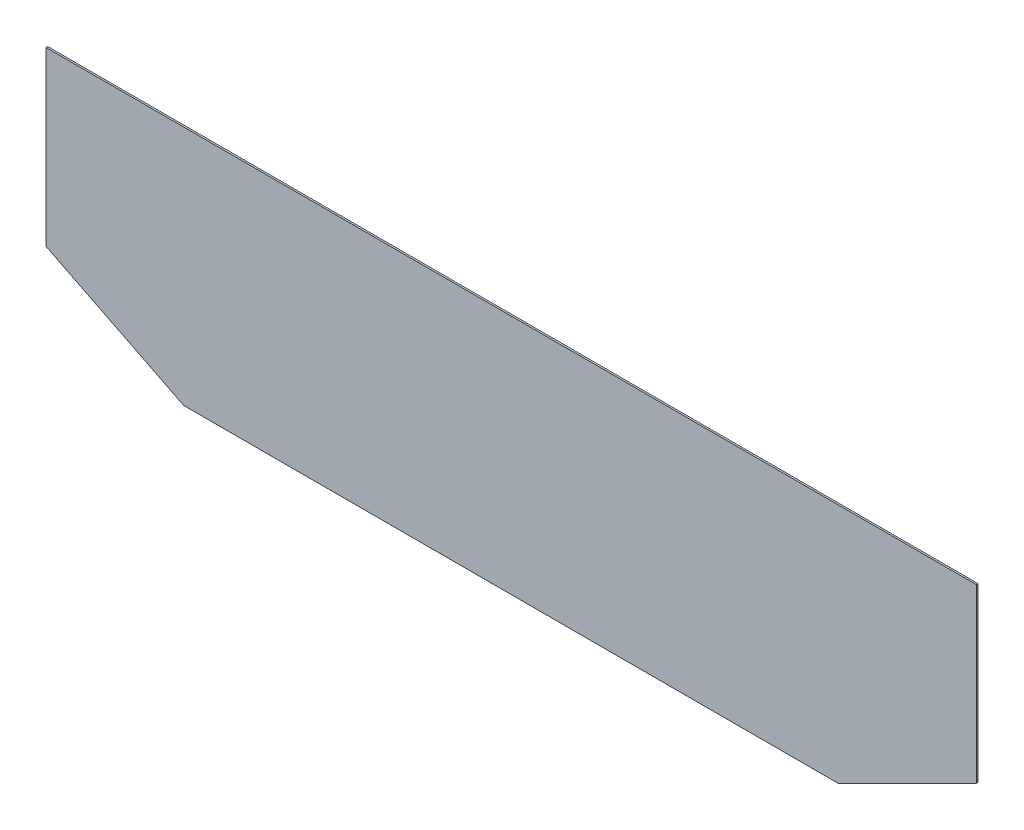
ISO-10303-21;
HEADER;
FILE_DESCRIPTION(('STEP AP214'),'2;1');
FILE_NAME('part.step','',(''),(''),'','','');
FILE_SCHEMA(('AUTOMOTIVE_DESIGN { 1 0 10303 214 1 1 1 1 }'));
ENDSEC;
DATA;
#1=APPLICATION_CONTEXT('core data for automotive mechanical design processes');
#2=APPLICATION_PROTOCOL_DEFINITION('international standard','automotive_design',2000,#1);
#3=PRODUCT_CONTEXT('',#1,'mechanical');
#4=PRODUCT('Part','Part','',(#3));
#5=PRODUCT_RELATED_PRODUCT_CATEGORY('part','',(#4));
#6=PRODUCT_DEFINITION_FORMATION('','',#4);
#7=PRODUCT_DEFINITION_CONTEXT('part definition',#1,'design');
#8=PRODUCT_DEFINITION('design','',#6,#7);
#9=PRODUCT_DEFINITION_SHAPE('','',#8);
#10=(LENGTH_UNIT() NAMED_UNIT(*) SI_UNIT(.MILLI.,.METRE.));
#11=(NAMED_UNIT(*) PLANE_ANGLE_UNIT() SI_UNIT($,.RADIAN.));
#12=(NAMED_UNIT(*) SI_UNIT($,.STERADIAN.) SOLID_ANGLE_UNIT());
#13=UNCERTAINTY_MEASURE_WITH_UNIT(LENGTH_MEASURE(1.E-05),#10,'distance_accuracy_value','');
#14=(GEOMETRIC_REPRESENTATION_CONTEXT(3) GLOBAL_UNCERTAINTY_ASSIGNED_CONTEXT((#13)) GLOBAL_UNIT_ASSIGNED_CONTEXT((#10,
#11,#12)) REPRESENTATION_CONTEXT('',''));
#15=CARTESIAN_POINT('',(0.,0.,0.));
#16=DIRECTION('',(0.,0.,1.));
#17=DIRECTION('',(1.,0.,0.));
#18=AXIS2_PLACEMENT_3D('',#15,#16,#17);
#19=CARTESIAN_POINT('',(-135.,0.,0.5));
#20=DIRECTION('',(1.,0.,0.));
#21=DIRECTION('',(0.,0.,-1.));
#22=AXIS2_PLACEMENT_3D('',#19,#20,#21);
#23=PLANE('',#22);
#24=DIRECTION('',(0.,-1.,0.));
#25=VECTOR('',#24,1.);
#26=CARTESIAN_POINT('',(-135.,0.,0.));
#27=LINE('',#26,#25);
#28=CARTESIAN_POINT('',(-135.,35.,0.));
#29=VERTEX_POINT('',#28);
#30=CARTESIAN_POINT('',(-135.,-15.,0.));
#31=VERTEX_POINT('',#30);
#32=EDGE_CURVE('E118',#29,#31,#27,.T.);
#33=ORIENTED_EDGE('',*,*,#32,.T.);
#34=DIRECTION('',(0.,0.,-1.));
#35=VECTOR('',#34,1.);
#36=CARTESIAN_POINT('',(-135.,-15.,0.5));
#37=LINE('',#36,#35);
#38=CARTESIAN_POINT('',(-135.,-15.,0.5));
#39=VERTEX_POINT('',#38);
#40=EDGE_CURVE('E11',#39,#31,#37,.T.);
#41=ORIENTED_EDGE('',*,*,#40,.F.);
#42=DIRECTION('',(0.,-1.,0.));
#43=VECTOR('',#42,1.);
#44=CARTESIAN_POINT('',(-135.,0.,0.5));
#45=LINE('',#44,#43);
#46=CARTESIAN_POINT('',(-135.,35.,0.5));
#47=VERTEX_POINT('',#46);
#48=EDGE_CURVE('E131',#47,#39,#45,.T.);
#49=ORIENTED_EDGE('',*,*,#48,.F.);
#50=DIRECTION('',(0.,0.,-1.));
#51=VECTOR('',#50,1.);
#52=CARTESIAN_POINT('',(-135.,35.,0.5));
#53=LINE('',#52,#51);
#54=EDGE_CURVE('E50',#47,#29,#53,.T.);
#55=ORIENTED_EDGE('',*,*,#54,.T.);
#56=EDGE_LOOP('',(#33,#41,#49,#55));
#57=FACE_BOUND('',#56,.T.);
#58=ADVANCED_FACE('F34',(#57),#23,.F.);
#59=CARTESIAN_POINT('',(-33.,-66.,0.5));
#60=DIRECTION('',(0.447213595499958,0.894427190999916,0.));
#61=DIRECTION('',(-0.894427190999916,0.447213595499958,0.));
#62=AXIS2_PLACEMENT_3D('',#59,#60,#61);
#63=PLANE('',#62);
#64=DIRECTION('',(0.894427190999916,-0.447213595499958,0.));
#65=VECTOR('',#64,1.);
#66=CARTESIAN_POINT('',(-33.,-66.,0.));
#67=LINE('',#66,#65);
#68=CARTESIAN_POINT('',(-94.9999999999999,-35.,0.));
#69=VERTEX_POINT('',#68);
#70=EDGE_CURVE('E120',#31,#69,#67,.T.);
#71=ORIENTED_EDGE('',*,*,#70,.T.);
#72=DIRECTION('',(0.,0.,-1.));
#73=VECTOR('',#72,1.);
#74=CARTESIAN_POINT('',(-94.9999999999999,-35.,0.5));
#75=LINE('',#74,#73);
#76=CARTESIAN_POINT('',(-94.9999999999999,-35.,0.5));
#77=VERTEX_POINT('',#76);
#78=EDGE_CURVE('E42',#77,#69,#75,.T.);
#79=ORIENTED_EDGE('',*,*,#78,.F.);
#80=DIRECTION('',(0.894427190999916,-0.447213595499958,0.));
#81=VECTOR('',#80,1.);
#82=CARTESIAN_POINT('',(-33.,-66.,0.5));
#83=LINE('',#82,#81);
#84=EDGE_CURVE('E82',#39,#77,#83,.T.);
#85=ORIENTED_EDGE('',*,*,#84,.F.);
#86=ORIENTED_EDGE('',*,*,#40,.T.);
#87=EDGE_LOOP('',(#71,#79,#85,#86));
#88=FACE_BOUND('',#87,.T.);
#89=ADVANCED_FACE('F151',(#88),#63,.F.);
#90=CARTESIAN_POINT('',(0.,-35.,0.5));
#91=DIRECTION('',(0.,1.,0.));
#92=DIRECTION('',(0.,0.,1.));
#93=AXIS2_PLACEMENT_3D('',#90,#91,#92);
#94=PLANE('',#93);
#95=DIRECTION('',(1.,0.,0.));
#96=VECTOR('',#95,1.);
#97=CARTESIAN_POINT('',(0.,-35.,0.));
#98=LINE('',#97,#96);
#99=CARTESIAN_POINT('',(95.0000000000001,-35.,0.));
#100=VERTEX_POINT('',#99);
#101=EDGE_CURVE('E122',#69,#100,#98,.T.);
#102=ORIENTED_EDGE('',*,*,#101,.T.);
#103=DIRECTION('',(0.,0.,-1.));
#104=VECTOR('',#103,1.);
#105=CARTESIAN_POINT('',(95.0000000000001,-35.,0.5));
#106=LINE('',#105,#104);
#107=CARTESIAN_POINT('',(95.0000000000001,-35.,0.5));
#108=VERTEX_POINT('',#107);
#109=EDGE_CURVE('E101',#108,#100,#106,.T.);
#110=ORIENTED_EDGE('',*,*,#109,.F.);
#111=DIRECTION('',(1.,0.,0.));
#112=VECTOR('',#111,1.);
#113=CARTESIAN_POINT('',(0.,-35.,0.5));
#114=LINE('',#113,#112);
#115=EDGE_CURVE('E109',#77,#108,#114,.T.);
#116=ORIENTED_EDGE('',*,*,#115,.F.);
#117=ORIENTED_EDGE('',*,*,#78,.T.);
#118=EDGE_LOOP('',(#102,#110,#116,#117));
#119=FACE_BOUND('',#118,.T.);
#120=ADVANCED_FACE('F137',(#119),#94,.F.);
#121=CARTESIAN_POINT('',(33.,-66.,0.5));
#122=DIRECTION('',(0.447213595499958,-0.894427190999916,0.));
#123=DIRECTION('',(0.894427190999916,0.447213595499958,0.));
#124=AXIS2_PLACEMENT_3D('',#121,#122,#123);
#125=PLANE('',#124);
#126=DIRECTION('',(-0.894427190999916,-0.447213595499958,0.));
#127=VECTOR('',#126,1.);
#128=CARTESIAN_POINT('',(33.,-66.,0.));
#129=LINE('',#128,#127);
#130=CARTESIAN_POINT('',(135.,-15.,0.));
#131=VERTEX_POINT('',#130);
#132=EDGE_CURVE('E97',#131,#100,#129,.T.);
#133=ORIENTED_EDGE('',*,*,#132,.F.);
#134=DIRECTION('',(0.,0.,-1.));
#135=VECTOR('',#134,1.);
#136=CARTESIAN_POINT('',(135.,-15.,0.5));
#137=LINE('',#136,#135);
#138=CARTESIAN_POINT('',(135.,-15.,0.5));
#139=VERTEX_POINT('',#138);
#140=EDGE_CURVE('E92',#139,#131,#137,.T.);
#141=ORIENTED_EDGE('',*,*,#140,.F.);
#142=DIRECTION('',(-0.894427190999916,-0.447213595499958,0.));
#143=VECTOR('',#142,1.);
#144=CARTESIAN_POINT('',(33.,-66.,0.5));
#145=LINE('',#144,#143);
#146=EDGE_CURVE('E95',#139,#108,#145,.T.);
#147=ORIENTED_EDGE('',*,*,#146,.T.);
#148=ORIENTED_EDGE('',*,*,#109,.T.);
#149=EDGE_LOOP('',(#133,#141,#147,#148));
#150=FACE_BOUND('',#149,.T.);
#151=ADVANCED_FACE('F94',(#150),#125,.T.);
#152=CARTESIAN_POINT('',(135.,0.,0.5));
#153=DIRECTION('',(1.,0.,0.));
#154=DIRECTION('',(0.,0.,-1.));
#155=AXIS2_PLACEMENT_3D('',#152,#153,#154);
#156=PLANE('',#155);
#157=DIRECTION('',(0.,-1.,0.));
#158=VECTOR('',#157,1.);
#159=CARTESIAN_POINT('',(135.,0.,0.));
#160=LINE('',#159,#158);
#161=CARTESIAN_POINT('',(135.,35.,0.));
#162=VERTEX_POINT('',#161);
#163=EDGE_CURVE('E126',#162,#131,#160,.T.);
#164=ORIENTED_EDGE('',*,*,#163,.F.);
#165=DIRECTION('',(0.,0.,-1.));
#166=VECTOR('',#165,1.);
#167=CARTESIAN_POINT('',(135.,35.,0.5));
#168=LINE('',#167,#166);
#169=CARTESIAN_POINT('',(135.,35.,0.5));
#170=VERTEX_POINT('',#169);
#171=EDGE_CURVE('E70',#170,#162,#168,.T.);
#172=ORIENTED_EDGE('',*,*,#171,.F.);
#173=DIRECTION('',(0.,-1.,0.));
#174=VECTOR('',#173,1.);
#175=CARTESIAN_POINT('',(135.,0.,0.5));
#176=LINE('',#175,#174);
#177=EDGE_CURVE('E107',#170,#139,#176,.T.);
#178=ORIENTED_EDGE('',*,*,#177,.T.);
#179=ORIENTED_EDGE('',*,*,#140,.T.);
#180=EDGE_LOOP('',(#164,#172,#178,#179));
#181=FACE_BOUND('',#180,.T.);
#182=ADVANCED_FACE('F112',(#181),#156,.T.);
#183=CARTESIAN_POINT('',(0.,35.,0.5));
#184=DIRECTION('',(0.,1.,0.));
#185=DIRECTION('',(0.,0.,1.));
#186=AXIS2_PLACEMENT_3D('',#183,#184,#185);
#187=PLANE('',#186);
#188=DIRECTION('',(1.,0.,0.));
#189=VECTOR('',#188,1.);
#190=CARTESIAN_POINT('',(0.,35.,0.));
#191=LINE('',#190,#189);
#192=EDGE_CURVE('E128',#29,#162,#191,.T.);
#193=ORIENTED_EDGE('',*,*,#192,.F.);
#194=ORIENTED_EDGE('',*,*,#54,.F.);
#195=DIRECTION('',(1.,0.,0.));
#196=VECTOR('',#195,1.);
#197=CARTESIAN_POINT('',(0.,35.,0.5));
#198=LINE('',#197,#196);
#199=EDGE_CURVE('E113',#47,#170,#198,.T.);
#200=ORIENTED_EDGE('',*,*,#199,.T.);
#201=ORIENTED_EDGE('',*,*,#171,.T.);
#202=EDGE_LOOP('',(#193,#194,#200,#201));
#203=FACE_BOUND('',#202,.T.);
#204=ADVANCED_FACE('F140',(#203),#187,.T.);
#205=CARTESIAN_POINT('',(0.,0.,0.5));
#206=DIRECTION('',(0.,0.,1.));
#207=DIRECTION('',(1.,0.,0.));
#208=AXIS2_PLACEMENT_3D('',#205,#206,#207);
#209=PLANE('',#208);
#210=ORIENTED_EDGE('',*,*,#48,.T.);
#211=ORIENTED_EDGE('',*,*,#84,.T.);
#212=ORIENTED_EDGE('',*,*,#115,.T.);
#213=ORIENTED_EDGE('',*,*,#146,.F.);
#214=ORIENTED_EDGE('',*,*,#177,.F.);
#215=ORIENTED_EDGE('',*,*,#199,.F.);
#216=EDGE_LOOP('',(#210,#211,#212,#213,#214,#215));
#217=FACE_BOUND('',#216,.T.);
#218=ADVANCED_FACE('F105',(#217),#209,.T.);
#219=CARTESIAN_POINT('',(0.,0.,0.));
#220=DIRECTION('',(0.,0.,1.));
#221=DIRECTION('',(1.,0.,0.));
#222=AXIS2_PLACEMENT_3D('',#219,#220,#221);
#223=PLANE('',#222);
#224=ORIENTED_EDGE('',*,*,#32,.F.);
#225=ORIENTED_EDGE('',*,*,#192,.T.);
#226=ORIENTED_EDGE('',*,*,#163,.T.);
#227=ORIENTED_EDGE('',*,*,#132,.T.);
#228=ORIENTED_EDGE('',*,*,#101,.F.);
#229=ORIENTED_EDGE('',*,*,#70,.F.);
#230=EDGE_LOOP('',(#224,#225,#226,#227,#228,#229));
#231=FACE_BOUND('',#230,.T.);
#232=ADVANCED_FACE('F139',(#231),#223,.F.);
#233=CLOSED_SHELL('',(#58,#89,#120,#151,#182,#204,#218,#232));
#234=MANIFOLD_SOLID_BREP('B2',#233);
#235=ADVANCED_BREP_SHAPE_REPRESENTATION('',(#18,#234),#14);
#236=SHAPE_DEFINITION_REPRESENTATION(#9,#235);
ENDSEC;
END-ISO-10303-21;
